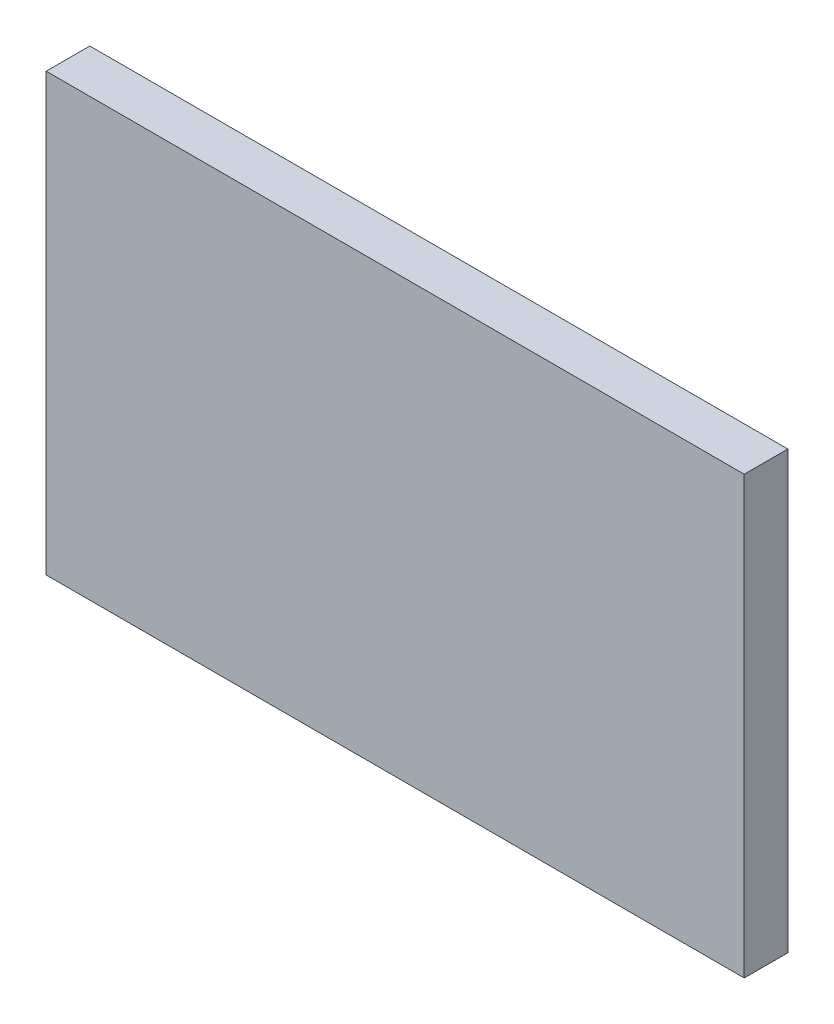
ISO-10303-21;
HEADER;
FILE_DESCRIPTION(('STEP AP214'),'2;1');
FILE_NAME('part.step','',(''),(''),'','','');
FILE_SCHEMA(('AUTOMOTIVE_DESIGN { 1 0 10303 214 1 1 1 1 }'));
ENDSEC;
DATA;
#1=APPLICATION_CONTEXT('core data for automotive mechanical design processes');
#2=APPLICATION_PROTOCOL_DEFINITION('international standard','automotive_design',2000,#1);
#3=PRODUCT_CONTEXT('',#1,'mechanical');
#4=PRODUCT('Part','Part','',(#3));
#5=PRODUCT_RELATED_PRODUCT_CATEGORY('part','',(#4));
#6=PRODUCT_DEFINITION_FORMATION('','',#4);
#7=PRODUCT_DEFINITION_CONTEXT('part definition',#1,'design');
#8=PRODUCT_DEFINITION('design','',#6,#7);
#9=PRODUCT_DEFINITION_SHAPE('','',#8);
#10=(LENGTH_UNIT() NAMED_UNIT(*) SI_UNIT(.MILLI.,.METRE.));
#11=(NAMED_UNIT(*) PLANE_ANGLE_UNIT() SI_UNIT($,.RADIAN.));
#12=(NAMED_UNIT(*) SI_UNIT($,.STERADIAN.) SOLID_ANGLE_UNIT());
#13=UNCERTAINTY_MEASURE_WITH_UNIT(LENGTH_MEASURE(1.E-05),#10,'distance_accuracy_value','');
#14=(GEOMETRIC_REPRESENTATION_CONTEXT(3) GLOBAL_UNCERTAINTY_ASSIGNED_CONTEXT((#13)) GLOBAL_UNIT_ASSIGNED_CONTEXT((#10,
#11,#12)) REPRESENTATION_CONTEXT('',''));
#15=CARTESIAN_POINT('',(0.,0.,0.));
#16=DIRECTION('',(0.,0.,1.));
#17=DIRECTION('',(1.,0.,0.));
#18=AXIS2_PLACEMENT_3D('',#15,#16,#17);
#19=CARTESIAN_POINT('',(-40.,-25.,5.));
#20=DIRECTION('',(1.,0.,0.));
#21=DIRECTION('',(0.,0.,-1.));
#22=AXIS2_PLACEMENT_3D('',#19,#20,#21);
#23=PLANE('',#22);
#24=DIRECTION('',(0.,-1.,0.));
#25=VECTOR('',#24,1.);
#26=CARTESIAN_POINT('',(-40.,-25.,0.));
#27=LINE('',#26,#25);
#28=CARTESIAN_POINT('',(-40.,25.,0.));
#29=VERTEX_POINT('',#28);
#30=CARTESIAN_POINT('',(-40.,-25.,0.));
#31=VERTEX_POINT('',#30);
#32=EDGE_CURVE('E100',#29,#31,#27,.T.);
#33=ORIENTED_EDGE('',*,*,#32,.T.);
#34=DIRECTION('',(0.,0.,-1.));
#35=VECTOR('',#34,1.);
#36=CARTESIAN_POINT('',(-40.,-25.,5.));
#37=LINE('',#36,#35);
#38=CARTESIAN_POINT('',(-40.,-25.,5.));
#39=VERTEX_POINT('',#38);
#40=EDGE_CURVE('E11',#39,#31,#37,.T.);
#41=ORIENTED_EDGE('',*,*,#40,.F.);
#42=DIRECTION('',(0.,-1.,0.));
#43=VECTOR('',#42,1.);
#44=CARTESIAN_POINT('',(-40.,-25.,5.));
#45=LINE('',#44,#43);
#46=CARTESIAN_POINT('',(-40.,25.,5.));
#47=VERTEX_POINT('',#46);
#48=EDGE_CURVE('E88',#47,#39,#45,.T.);
#49=ORIENTED_EDGE('',*,*,#48,.F.);
#50=DIRECTION('',(0.,0.,-1.));
#51=VECTOR('',#50,1.);
#52=CARTESIAN_POINT('',(-40.,25.,5.));
#53=LINE('',#52,#51);
#54=EDGE_CURVE('E96',#47,#29,#53,.T.);
#55=ORIENTED_EDGE('',*,*,#54,.T.);
#56=EDGE_LOOP('',(#33,#41,#49,#55));
#57=FACE_BOUND('',#56,.T.);
#58=ADVANCED_FACE('F37',(#57),#23,.F.);
#59=CARTESIAN_POINT('',(40.,-25.,5.));
#60=DIRECTION('',(0.,1.,0.));
#61=DIRECTION('',(-1.,0.,0.));
#62=AXIS2_PLACEMENT_3D('',#59,#60,#61);
#63=PLANE('',#62);
#64=DIRECTION('',(1.,0.,0.));
#65=VECTOR('',#64,1.);
#66=CARTESIAN_POINT('',(40.,-25.,0.));
#67=LINE('',#66,#65);
#68=CARTESIAN_POINT('',(40.,-25.,0.));
#69=VERTEX_POINT('',#68);
#70=EDGE_CURVE('E92',#31,#69,#67,.T.);
#71=ORIENTED_EDGE('',*,*,#70,.T.);
#72=DIRECTION('',(0.,0.,-1.));
#73=VECTOR('',#72,1.);
#74=CARTESIAN_POINT('',(40.,-25.,5.));
#75=LINE('',#74,#73);
#76=CARTESIAN_POINT('',(40.,-25.,5.));
#77=VERTEX_POINT('',#76);
#78=EDGE_CURVE('E45',#77,#69,#75,.T.);
#79=ORIENTED_EDGE('',*,*,#78,.F.);
#80=DIRECTION('',(1.,0.,0.));
#81=VECTOR('',#80,1.);
#82=CARTESIAN_POINT('',(40.,-25.,5.));
#83=LINE('',#82,#81);
#84=EDGE_CURVE('E83',#39,#77,#83,.T.);
#85=ORIENTED_EDGE('',*,*,#84,.F.);
#86=ORIENTED_EDGE('',*,*,#40,.T.);
#87=EDGE_LOOP('',(#71,#79,#85,#86));
#88=FACE_BOUND('',#87,.T.);
#89=ADVANCED_FACE('F91',(#88),#63,.F.);
#90=CARTESIAN_POINT('',(40.,-25.,5.));
#91=DIRECTION('',(-1.,0.,0.));
#92=DIRECTION('',(0.,0.,1.));
#93=AXIS2_PLACEMENT_3D('',#90,#91,#92);
#94=PLANE('',#93);
#95=DIRECTION('',(0.,1.,0.));
#96=VECTOR('',#95,1.);
#97=CARTESIAN_POINT('',(40.,-25.,0.));
#98=LINE('',#97,#96);
#99=CARTESIAN_POINT('',(40.,25.,0.));
#100=VERTEX_POINT('',#99);
#101=EDGE_CURVE('E70',#69,#100,#98,.T.);
#102=ORIENTED_EDGE('',*,*,#101,.T.);
#103=DIRECTION('',(0.,0.,-1.));
#104=VECTOR('',#103,1.);
#105=CARTESIAN_POINT('',(40.,25.,5.));
#106=LINE('',#105,#104);
#107=CARTESIAN_POINT('',(40.,25.,5.));
#108=VERTEX_POINT('',#107);
#109=EDGE_CURVE('E93',#108,#100,#106,.T.);
#110=ORIENTED_EDGE('',*,*,#109,.F.);
#111=DIRECTION('',(0.,1.,0.));
#112=VECTOR('',#111,1.);
#113=CARTESIAN_POINT('',(40.,-25.,5.));
#114=LINE('',#113,#112);
#115=EDGE_CURVE('E86',#77,#108,#114,.T.);
#116=ORIENTED_EDGE('',*,*,#115,.F.);
#117=ORIENTED_EDGE('',*,*,#78,.T.);
#118=EDGE_LOOP('',(#102,#110,#116,#117));
#119=FACE_BOUND('',#118,.T.);
#120=ADVANCED_FACE('F94',(#119),#94,.F.);
#121=CARTESIAN_POINT('',(40.,25.,5.));
#122=DIRECTION('',(0.,-1.,0.));
#123=DIRECTION('',(1.,0.,0.));
#124=AXIS2_PLACEMENT_3D('',#121,#122,#123);
#125=PLANE('',#124);
#126=DIRECTION('',(-1.,0.,0.));
#127=VECTOR('',#126,1.);
#128=CARTESIAN_POINT('',(40.,25.,0.));
#129=LINE('',#128,#127);
#130=EDGE_CURVE('E76',#100,#29,#129,.T.);
#131=ORIENTED_EDGE('',*,*,#130,.T.);
#132=ORIENTED_EDGE('',*,*,#54,.F.);
#133=DIRECTION('',(-1.,0.,0.));
#134=VECTOR('',#133,1.);
#135=CARTESIAN_POINT('',(40.,25.,5.));
#136=LINE('',#135,#134);
#137=EDGE_CURVE('E53',#108,#47,#136,.T.);
#138=ORIENTED_EDGE('',*,*,#137,.F.);
#139=ORIENTED_EDGE('',*,*,#109,.T.);
#140=EDGE_LOOP('',(#131,#132,#138,#139));
#141=FACE_BOUND('',#140,.T.);
#142=ADVANCED_FACE('F107',(#141),#125,.F.);
#143=CARTESIAN_POINT('',(0.,0.,5.));
#144=DIRECTION('',(0.,0.,1.));
#145=DIRECTION('',(1.,0.,0.));
#146=AXIS2_PLACEMENT_3D('',#143,#144,#145);
#147=PLANE('',#146);
#148=ORIENTED_EDGE('',*,*,#48,.T.);
#149=ORIENTED_EDGE('',*,*,#84,.T.);
#150=ORIENTED_EDGE('',*,*,#115,.T.);
#151=ORIENTED_EDGE('',*,*,#137,.T.);
#152=EDGE_LOOP('',(#148,#149,#150,#151));
#153=FACE_BOUND('',#152,.T.);
#154=ADVANCED_FACE('F84',(#153),#147,.T.);
#155=CARTESIAN_POINT('',(0.,0.,0.));
#156=DIRECTION('',(0.,0.,1.));
#157=DIRECTION('',(1.,0.,0.));
#158=AXIS2_PLACEMENT_3D('',#155,#156,#157);
#159=PLANE('',#158);
#160=ORIENTED_EDGE('',*,*,#32,.F.);
#161=ORIENTED_EDGE('',*,*,#130,.F.);
#162=ORIENTED_EDGE('',*,*,#101,.F.);
#163=ORIENTED_EDGE('',*,*,#70,.F.);
#164=EDGE_LOOP('',(#160,#161,#162,#163));
#165=FACE_BOUND('',#164,.T.);
#166=ADVANCED_FACE('F110',(#165),#159,.F.);
#167=CLOSED_SHELL('',(#58,#89,#120,#142,#154,#166));
#168=MANIFOLD_SOLID_BREP('B2',#167);
#169=ADVANCED_BREP_SHAPE_REPRESENTATION('',(#18,#168),#14);
#170=SHAPE_DEFINITION_REPRESENTATION(#9,#169);
ENDSEC;
END-ISO-10303-21;
